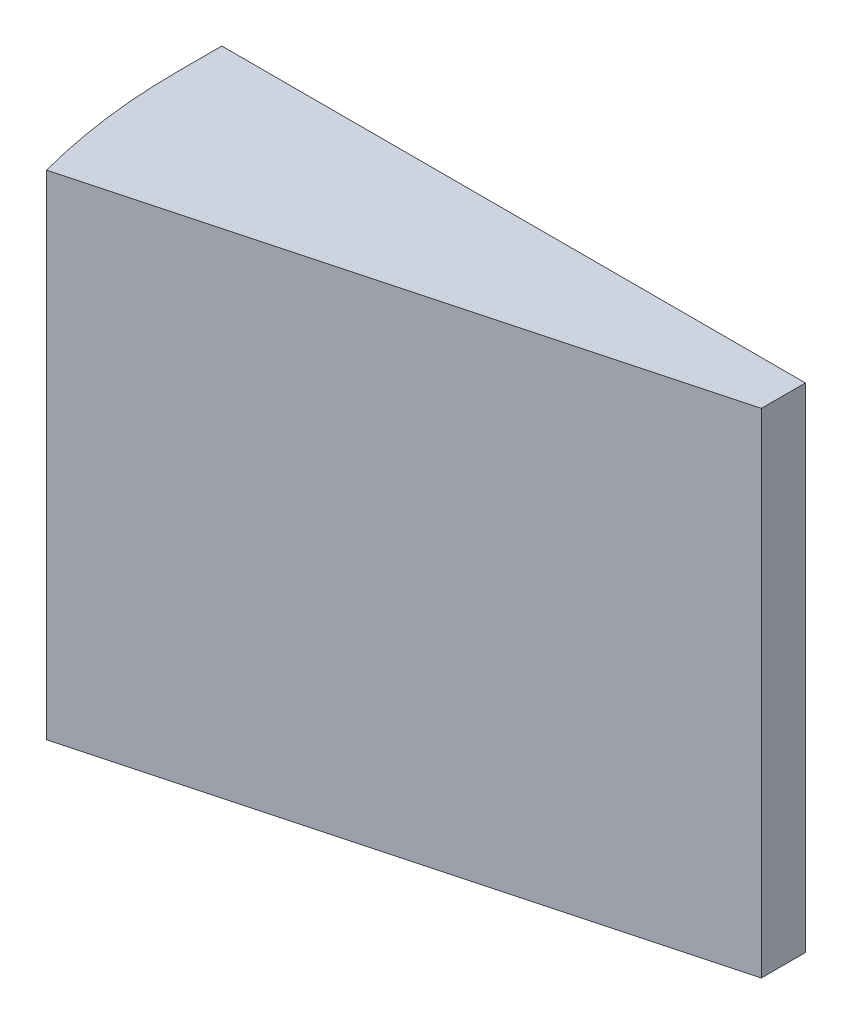
ISO-10303-21;
HEADER;
FILE_DESCRIPTION(('STEP AP214'),'2;1');
FILE_NAME('part.step','',(''),(''),'','','');
FILE_SCHEMA(('AUTOMOTIVE_DESIGN { 1 0 10303 214 1 1 1 1 }'));
ENDSEC;
DATA;
#1=APPLICATION_CONTEXT('core data for automotive mechanical design processes');
#2=APPLICATION_PROTOCOL_DEFINITION('international standard','automotive_design',2000,#1);
#3=PRODUCT_CONTEXT('',#1,'mechanical');
#4=PRODUCT('Part','Part','',(#3));
#5=PRODUCT_RELATED_PRODUCT_CATEGORY('part','',(#4));
#6=PRODUCT_DEFINITION_FORMATION('','',#4);
#7=PRODUCT_DEFINITION_CONTEXT('part definition',#1,'design');
#8=PRODUCT_DEFINITION('design','',#6,#7);
#9=PRODUCT_DEFINITION_SHAPE('','',#8);
#10=(LENGTH_UNIT() NAMED_UNIT(*) SI_UNIT(.MILLI.,.METRE.));
#11=(NAMED_UNIT(*) PLANE_ANGLE_UNIT() SI_UNIT($,.RADIAN.));
#12=(NAMED_UNIT(*) SI_UNIT($,.STERADIAN.) SOLID_ANGLE_UNIT());
#13=UNCERTAINTY_MEASURE_WITH_UNIT(LENGTH_MEASURE(1.E-05),#10,'distance_accuracy_value','');
#14=(GEOMETRIC_REPRESENTATION_CONTEXT(3) GLOBAL_UNCERTAINTY_ASSIGNED_CONTEXT((#13)) GLOBAL_UNIT_ASSIGNED_CONTEXT((#10,
#11,#12)) REPRESENTATION_CONTEXT('',''));
#15=CARTESIAN_POINT('',(0.,0.,0.));
#16=DIRECTION('',(0.,0.,1.));
#17=DIRECTION('',(1.,0.,0.));
#18=AXIS2_PLACEMENT_3D('',#15,#16,#17);
#19=CARTESIAN_POINT('',(13.25,11.2,2.));
#20=DIRECTION('',(-1.,0.,0.));
#21=DIRECTION('',(0.,-1.,0.));
#22=AXIS2_PLACEMENT_3D('',#19,#20,#21);
#23=PLANE('',#22);
#24=DIRECTION('',(0.,1.,0.));
#25=VECTOR('',#24,1.);
#26=CARTESIAN_POINT('',(13.25,11.2,0.));
#27=LINE('',#26,#25);
#28=CARTESIAN_POINT('',(13.25,-11.2,0.));
#29=VERTEX_POINT('',#28);
#30=CARTESIAN_POINT('',(13.25,11.2,0.));
#31=VERTEX_POINT('',#30);
#32=EDGE_CURVE('E110',#29,#31,#27,.T.);
#33=ORIENTED_EDGE('',*,*,#32,.T.);
#34=DIRECTION('',(0.,0.,-1.));
#35=VECTOR('',#34,1.);
#36=CARTESIAN_POINT('',(13.25,11.2,2.));
#37=LINE('',#36,#35);
#38=CARTESIAN_POINT('',(13.25,11.2,2.));
#39=VERTEX_POINT('',#38);
#40=EDGE_CURVE('E11',#39,#31,#37,.T.);
#41=ORIENTED_EDGE('',*,*,#40,.F.);
#42=DIRECTION('',(0.,1.,0.));
#43=VECTOR('',#42,1.);
#44=CARTESIAN_POINT('',(13.25,11.2,2.));
#45=LINE('',#44,#43);
#46=CARTESIAN_POINT('',(13.25,-11.2,2.));
#47=VERTEX_POINT('',#46);
#48=EDGE_CURVE('E105',#47,#39,#45,.T.);
#49=ORIENTED_EDGE('',*,*,#48,.F.);
#50=DIRECTION('',(0.,0.,-1.));
#51=VECTOR('',#50,1.);
#52=CARTESIAN_POINT('',(13.25,-11.2,2.));
#53=LINE('',#52,#51);
#54=EDGE_CURVE('E114',#47,#29,#53,.T.);
#55=ORIENTED_EDGE('',*,*,#54,.T.);
#56=EDGE_LOOP('',(#33,#41,#49,#55));
#57=FACE_BOUND('',#56,.T.);
#58=ADVANCED_FACE('F33',(#57),#23,.F.);
#59=CARTESIAN_POINT('',(-13.25,11.2,2.));
#60=DIRECTION('',(0.,-1.,0.));
#61=DIRECTION('',(0.,0.,-1.));
#62=AXIS2_PLACEMENT_3D('',#59,#60,#61);
#63=PLANE('',#62);
#64=DIRECTION('',(-1.,0.,0.));
#65=VECTOR('',#64,1.);
#66=CARTESIAN_POINT('',(-13.25,11.2,0.));
#67=LINE('',#66,#65);
#68=CARTESIAN_POINT('',(-13.25,11.2,0.));
#69=VERTEX_POINT('',#68);
#70=EDGE_CURVE('E116',#31,#69,#67,.T.);
#71=ORIENTED_EDGE('',*,*,#70,.T.);
#72=DIRECTION('',(0.,0.,-1.));
#73=VECTOR('',#72,1.);
#74=CARTESIAN_POINT('',(-13.25,11.2,2.));
#75=LINE('',#74,#73);
#76=CARTESIAN_POINT('',(-13.25,11.2,2.));
#77=VERTEX_POINT('',#76);
#78=EDGE_CURVE('E41',#77,#69,#75,.T.);
#79=ORIENTED_EDGE('',*,*,#78,.F.);
#80=CARTESIAN_POINT('',(13.25,11.2,2.));
#81=DIRECTION('',(0.,1.,0.));
#82=DIRECTION('',(0.,0.,1.));
#83=AXIS2_PLACEMENT_3D('',#80,#81,#82);
#84=CIRCLE('',#83,26.5);
#85=CARTESIAN_POINT('',(-12.3470343966604,11.2,8.85870469521663));
#86=VERTEX_POINT('',#85);
#87=EDGE_CURVE('E92',#77,#86,#84,.T.);
#88=ORIENTED_EDGE('',*,*,#87,.T.);
#89=DIRECTION('',(0.96592582628907,0.,-0.258819045102515));
#90=VECTOR('',#89,1.);
#91=CARTESIAN_POINT('',(13.25,11.2,2.));
#92=LINE('',#91,#90);
#93=EDGE_CURVE('E98',#86,#39,#92,.T.);
#94=ORIENTED_EDGE('',*,*,#93,.T.);
#95=ORIENTED_EDGE('',*,*,#40,.T.);
#96=EDGE_LOOP('',(#71,#79,#88,#94,#95));
#97=FACE_BOUND('',#96,.T.);
#98=ADVANCED_FACE('F102',(#97),#63,.F.);
#99=CARTESIAN_POINT('',(-13.25,11.2,2.));
#100=DIRECTION('',(1.,0.,0.));
#101=DIRECTION('',(0.,0.,-1.));
#102=AXIS2_PLACEMENT_3D('',#99,#100,#101);
#103=PLANE('',#102);
#104=DIRECTION('',(0.,-1.,0.));
#105=VECTOR('',#104,1.);
#106=CARTESIAN_POINT('',(-13.25,11.2,0.));
#107=LINE('',#106,#105);
#108=CARTESIAN_POINT('',(-13.25,-11.2,0.));
#109=VERTEX_POINT('',#108);
#110=EDGE_CURVE('E65',#69,#109,#107,.T.);
#111=ORIENTED_EDGE('',*,*,#110,.T.);
#112=DIRECTION('',(0.,0.,-1.));
#113=VECTOR('',#112,1.);
#114=CARTESIAN_POINT('',(-13.25,-11.2,2.));
#115=LINE('',#114,#113);
#116=CARTESIAN_POINT('',(-13.25,-11.2,2.));
#117=VERTEX_POINT('',#116);
#118=EDGE_CURVE('E49',#117,#109,#115,.T.);
#119=ORIENTED_EDGE('',*,*,#118,.F.);
#120=DIRECTION('',(0.,-1.,0.));
#121=VECTOR('',#120,1.);
#122=CARTESIAN_POINT('',(-13.25,11.2,2.));
#123=LINE('',#122,#121);
#124=EDGE_CURVE('E112',#77,#117,#123,.T.);
#125=ORIENTED_EDGE('',*,*,#124,.F.);
#126=ORIENTED_EDGE('',*,*,#78,.T.);
#127=EDGE_LOOP('',(#111,#119,#125,#126));
#128=FACE_BOUND('',#127,.T.);
#129=ADVANCED_FACE('F121',(#128),#103,.F.);
#130=CARTESIAN_POINT('',(-13.25,-11.2,2.));
#131=DIRECTION('',(0.,1.,0.));
#132=DIRECTION('',(0.,0.,1.));
#133=AXIS2_PLACEMENT_3D('',#130,#131,#132);
#134=PLANE('',#133);
#135=DIRECTION('',(1.,0.,0.));
#136=VECTOR('',#135,1.);
#137=CARTESIAN_POINT('',(-13.25,-11.2,0.));
#138=LINE('',#137,#136);
#139=EDGE_CURVE('E70',#109,#29,#138,.T.);
#140=ORIENTED_EDGE('',*,*,#139,.T.);
#141=ORIENTED_EDGE('',*,*,#54,.F.);
#142=DIRECTION('',(-0.96592582628907,0.,0.258819045102515));
#143=VECTOR('',#142,1.);
#144=CARTESIAN_POINT('',(13.25,-11.2,2.));
#145=LINE('',#144,#143);
#146=CARTESIAN_POINT('',(-12.3470343966604,-11.2,8.85870469521663));
#147=VERTEX_POINT('',#146);
#148=EDGE_CURVE('E97',#47,#147,#145,.T.);
#149=ORIENTED_EDGE('',*,*,#148,.T.);
#150=CARTESIAN_POINT('',(13.25,-11.2,2.));
#151=DIRECTION('',(0.,1.,0.));
#152=DIRECTION('',(0.,0.,1.));
#153=AXIS2_PLACEMENT_3D('',#150,#151,#152);
#154=CIRCLE('',#153,26.5);
#155=EDGE_CURVE('E93',#147,#117,#154,.F.);
#156=ORIENTED_EDGE('',*,*,#155,.T.);
#157=ORIENTED_EDGE('',*,*,#118,.T.);
#158=EDGE_LOOP('',(#140,#141,#149,#156,#157));
#159=FACE_BOUND('',#158,.T.);
#160=ADVANCED_FACE('F125',(#159),#134,.F.);
#161=CARTESIAN_POINT('',(0.,0.,0.));
#162=DIRECTION('',(0.,0.,1.));
#163=DIRECTION('',(1.,0.,0.));
#164=AXIS2_PLACEMENT_3D('',#161,#162,#163);
#165=PLANE('',#164);
#166=ORIENTED_EDGE('',*,*,#32,.F.);
#167=ORIENTED_EDGE('',*,*,#139,.F.);
#168=ORIENTED_EDGE('',*,*,#110,.F.);
#169=ORIENTED_EDGE('',*,*,#70,.F.);
#170=EDGE_LOOP('',(#166,#167,#168,#169));
#171=FACE_BOUND('',#170,.T.);
#172=ADVANCED_FACE('F124',(#171),#165,.F.);
#173=CARTESIAN_POINT('',(13.25,-38.5731954673945,2.));
#174=DIRECTION('',(0.258819045102515,0.,0.96592582628907));
#175=DIRECTION('',(0.96592582628907,0.,-0.258819045102515));
#176=AXIS2_PLACEMENT_3D('',#173,#174,#175);
#177=PLANE('',#176);
#178=ORIENTED_EDGE('',*,*,#148,.F.);
#179=ORIENTED_EDGE('',*,*,#48,.T.);
#180=ORIENTED_EDGE('',*,*,#93,.F.);
#181=DIRECTION('',(0.,1.,0.));
#182=VECTOR('',#181,1.);
#183=CARTESIAN_POINT('',(-12.3470343966604,-38.5731954673945,8.85870469521663));
#184=LINE('',#183,#182);
#185=EDGE_CURVE('E88',#147,#86,#184,.T.);
#186=ORIENTED_EDGE('',*,*,#185,.F.);
#187=EDGE_LOOP('',(#178,#179,#180,#186));
#188=FACE_BOUND('',#187,.T.);
#189=ADVANCED_FACE('F104',(#188),#177,.T.);
#190=CARTESIAN_POINT('',(13.25,-38.5731954673945,2.));
#191=DIRECTION('',(0.,1.,0.));
#192=DIRECTION('',(0.,0.,1.));
#193=AXIS2_PLACEMENT_3D('',#190,#191,#192);
#194=CYLINDRICAL_SURFACE('',#193,26.5);
#195=ORIENTED_EDGE('',*,*,#155,.F.);
#196=ORIENTED_EDGE('',*,*,#185,.T.);
#197=ORIENTED_EDGE('',*,*,#87,.F.);
#198=ORIENTED_EDGE('',*,*,#124,.T.);
#199=EDGE_LOOP('',(#195,#196,#197,#198));
#200=FACE_BOUND('',#199,.T.);
#201=ADVANCED_FACE('F90',(#200),#194,.T.);
#202=CLOSED_SHELL('',(#58,#98,#129,#160,#172,#189,#201));
#203=MANIFOLD_SOLID_BREP('B2',#202);
#204=ADVANCED_BREP_SHAPE_REPRESENTATION('',(#18,#203),#14);
#205=SHAPE_DEFINITION_REPRESENTATION(#9,#204);
ENDSEC;
END-ISO-10303-21;
